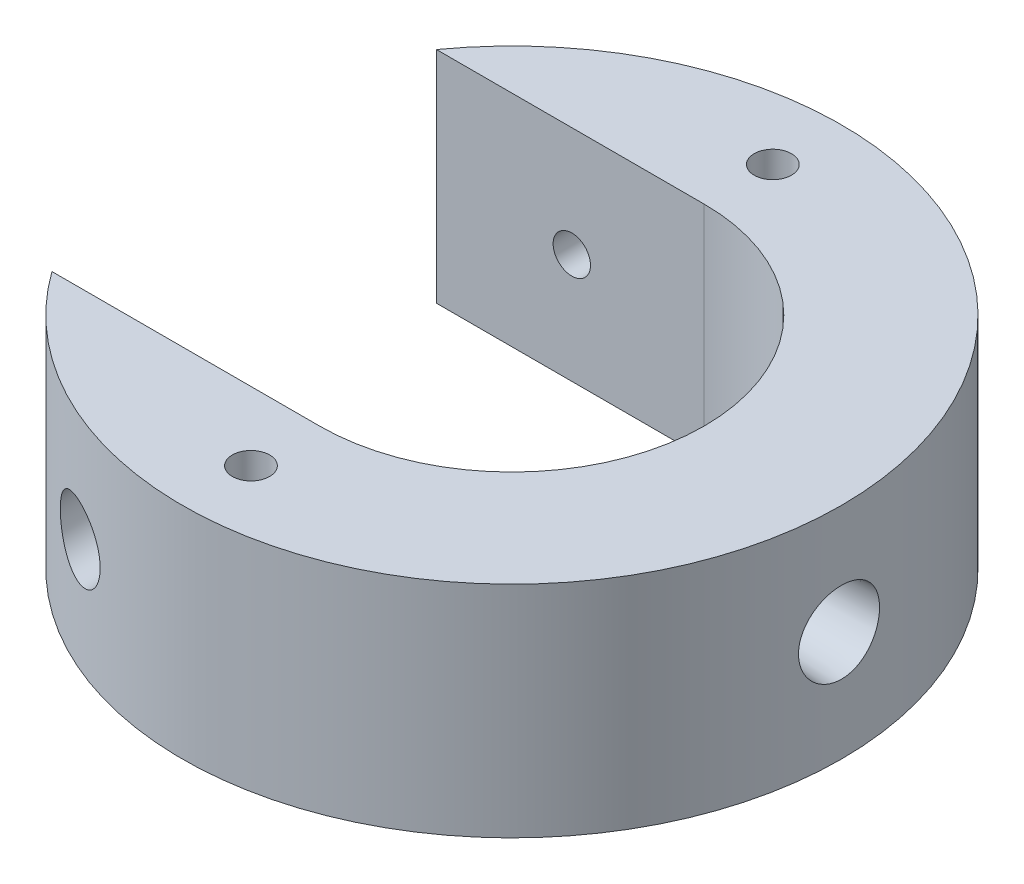
ISO-10303-21;
HEADER;
FILE_DESCRIPTION(('STEP AP214'),'2;1');
FILE_NAME('part.step','',(''),(''),'','','');
FILE_SCHEMA(('AUTOMOTIVE_DESIGN { 1 0 10303 214 1 1 1 1 }'));
ENDSEC;
DATA;
#1=APPLICATION_CONTEXT('core data for automotive mechanical design processes');
#2=APPLICATION_PROTOCOL_DEFINITION('international standard','automotive_design',2000,#1);
#3=PRODUCT_CONTEXT('',#1,'mechanical');
#4=PRODUCT('Part','Part','',(#3));
#5=PRODUCT_RELATED_PRODUCT_CATEGORY('part','',(#4));
#6=PRODUCT_DEFINITION_FORMATION('','',#4);
#7=PRODUCT_DEFINITION_CONTEXT('part definition',#1,'design');
#8=PRODUCT_DEFINITION('design','',#6,#7);
#9=PRODUCT_DEFINITION_SHAPE('','',#8);
#10=(LENGTH_UNIT() NAMED_UNIT(*) SI_UNIT(.MILLI.,.METRE.));
#11=(NAMED_UNIT(*) PLANE_ANGLE_UNIT() SI_UNIT($,.RADIAN.));
#12=(NAMED_UNIT(*) SI_UNIT($,.STERADIAN.) SOLID_ANGLE_UNIT());
#13=UNCERTAINTY_MEASURE_WITH_UNIT(LENGTH_MEASURE(1.E-05),#10,'distance_accuracy_value','');
#14=(GEOMETRIC_REPRESENTATION_CONTEXT(3) GLOBAL_UNCERTAINTY_ASSIGNED_CONTEXT((#13)) GLOBAL_UNIT_ASSIGNED_CONTEXT((#10,
#11,#12)) REPRESENTATION_CONTEXT('',''));
#15=CARTESIAN_POINT('',(0.,0.,0.));
#16=DIRECTION('',(0.,0.,1.));
#17=DIRECTION('',(1.,0.,0.));
#18=AXIS2_PLACEMENT_3D('',#15,#16,#17);
#19=CARTESIAN_POINT('',(0.,20.,0.));
#20=DIRECTION('',(0.,1.,0.));
#21=DIRECTION('',(0.,0.,1.));
#22=AXIS2_PLACEMENT_3D('',#19,#20,#21);
#23=PLANE('',#22);
#24=CARTESIAN_POINT('',(0.,20.,0.));
#25=DIRECTION('',(0.,1.,0.));
#26=DIRECTION('',(0.,0.,1.));
#27=AXIS2_PLACEMENT_3D('',#24,#25,#26);
#28=CIRCLE('',#27,30.);
#29=CARTESIAN_POINT('',(-24.3669858620224,20.,17.5));
#30=VERTEX_POINT('',#29);
#31=CARTESIAN_POINT('',(-24.3669858620224,20.,-17.5));
#32=VERTEX_POINT('',#31);
#33=EDGE_CURVE('E60',#30,#32,#28,.T.);
#34=ORIENTED_EDGE('',*,*,#33,.T.);
#35=DIRECTION('',(1.,0.,0.));
#36=VECTOR('',#35,1.);
#37=CARTESIAN_POINT('',(0.,20.,-17.5));
#38=LINE('',#37,#36);
#39=CARTESIAN_POINT('',(0.,20.,-17.5));
#40=VERTEX_POINT('',#39);
#41=EDGE_CURVE('E94',#32,#40,#38,.T.);
#42=ORIENTED_EDGE('',*,*,#41,.T.);
#43=CARTESIAN_POINT('',(0.,20.,0.));
#44=DIRECTION('',(0.,1.,0.));
#45=DIRECTION('',(0.,0.,1.));
#46=AXIS2_PLACEMENT_3D('',#43,#44,#45);
#47=CIRCLE('',#46,17.5);
#48=CARTESIAN_POINT('',(0.,20.,17.5));
#49=VERTEX_POINT('',#48);
#50=EDGE_CURVE('E105',#40,#49,#47,.F.);
#51=ORIENTED_EDGE('',*,*,#50,.T.);
#52=DIRECTION('',(1.,0.,0.));
#53=VECTOR('',#52,1.);
#54=CARTESIAN_POINT('',(0.,20.,17.5));
#55=LINE('',#54,#53);
#56=EDGE_CURVE('E117',#30,#49,#55,.T.);
#57=ORIENTED_EDGE('',*,*,#56,.F.);
#58=EDGE_LOOP('',(#34,#42,#51,#57));
#59=FACE_BOUND('',#58,.T.);
#60=CARTESIAN_POINT('',(0.,20.,-23.75));
#61=DIRECTION('',(0.,-1.,0.));
#62=DIRECTION('',(0.,0.,-1.));
#63=AXIS2_PLACEMENT_3D('',#60,#61,#62);
#64=CIRCLE('',#63,1.69999999999999);
#65=CARTESIAN_POINT('',(0.,20.,-25.45));
#66=VERTEX_POINT('',#65);
#67=EDGE_CURVE('E229',#66,#66,#64,.T.);
#68=ORIENTED_EDGE('',*,*,#67,.T.);
#69=EDGE_LOOP('',(#68));
#70=FACE_BOUND('',#69,.T.);
#71=CARTESIAN_POINT('',(0.,20.,23.75));
#72=DIRECTION('',(0.,-1.,0.));
#73=DIRECTION('',(0.,0.,-1.));
#74=AXIS2_PLACEMENT_3D('',#71,#72,#73);
#75=CIRCLE('',#74,1.69999999999999);
#76=CARTESIAN_POINT('',(0.,20.,22.05));
#77=VERTEX_POINT('',#76);
#78=EDGE_CURVE('E234',#77,#77,#75,.T.);
#79=ORIENTED_EDGE('',*,*,#78,.T.);
#80=EDGE_LOOP('',(#79));
#81=FACE_BOUND('',#80,.T.);
#82=ADVANCED_FACE('F45',(#59,#70,#81),#23,.T.);
#83=CARTESIAN_POINT('',(0.,0.,0.));
#84=DIRECTION('',(0.,1.,0.));
#85=DIRECTION('',(0.,0.,1.));
#86=AXIS2_PLACEMENT_3D('',#83,#84,#85);
#87=PLANE('',#86);
#88=CARTESIAN_POINT('',(0.,0.,-23.75));
#89=DIRECTION('',(0.,-1.,0.));
#90=DIRECTION('',(0.,0.,-1.));
#91=AXIS2_PLACEMENT_3D('',#88,#89,#90);
#92=CIRCLE('',#91,1.725);
#93=CARTESIAN_POINT('',(0.,0.,-25.475));
#94=VERTEX_POINT('',#93);
#95=EDGE_CURVE('E113',#94,#94,#92,.T.);
#96=ORIENTED_EDGE('',*,*,#95,.F.);
#97=EDGE_LOOP('',(#96));
#98=FACE_BOUND('',#97,.T.);
#99=CARTESIAN_POINT('',(0.,0.,23.75));
#100=DIRECTION('',(0.,-1.,0.));
#101=DIRECTION('',(0.,0.,-1.));
#102=AXIS2_PLACEMENT_3D('',#99,#100,#101);
#103=CIRCLE('',#102,1.725);
#104=CARTESIAN_POINT('',(0.,0.,22.025));
#105=VERTEX_POINT('',#104);
#106=EDGE_CURVE('E225',#105,#105,#103,.T.);
#107=ORIENTED_EDGE('',*,*,#106,.F.);
#108=EDGE_LOOP('',(#107));
#109=FACE_BOUND('',#108,.T.);
#110=DIRECTION('',(1.,0.,0.));
#111=VECTOR('',#110,1.);
#112=CARTESIAN_POINT('',(0.,0.,-17.5));
#113=LINE('',#112,#111);
#114=CARTESIAN_POINT('',(-24.3669858620224,0.,-17.5));
#115=VERTEX_POINT('',#114);
#116=CARTESIAN_POINT('',(0.,0.,-17.5));
#117=VERTEX_POINT('',#116);
#118=EDGE_CURVE('E68',#115,#117,#113,.T.);
#119=ORIENTED_EDGE('',*,*,#118,.F.);
#120=CARTESIAN_POINT('',(0.,0.,0.));
#121=DIRECTION('',(0.,1.,0.));
#122=DIRECTION('',(0.,0.,1.));
#123=AXIS2_PLACEMENT_3D('',#120,#121,#122);
#124=CIRCLE('',#123,30.);
#125=CARTESIAN_POINT('',(-24.3669858620224,0.,17.5));
#126=VERTEX_POINT('',#125);
#127=EDGE_CURVE('E111',#126,#115,#124,.T.);
#128=ORIENTED_EDGE('',*,*,#127,.F.);
#129=DIRECTION('',(1.,0.,0.));
#130=VECTOR('',#129,1.);
#131=CARTESIAN_POINT('',(0.,0.,17.5));
#132=LINE('',#131,#130);
#133=CARTESIAN_POINT('',(0.,0.,17.5));
#134=VERTEX_POINT('',#133);
#135=EDGE_CURVE('E104',#126,#134,#132,.T.);
#136=ORIENTED_EDGE('',*,*,#135,.T.);
#137=CARTESIAN_POINT('',(0.,0.,0.));
#138=DIRECTION('',(0.,1.,0.));
#139=DIRECTION('',(0.,0.,1.));
#140=AXIS2_PLACEMENT_3D('',#137,#138,#139);
#141=CIRCLE('',#140,17.5);
#142=EDGE_CURVE('E247',#117,#134,#141,.F.);
#143=ORIENTED_EDGE('',*,*,#142,.F.);
#144=EDGE_LOOP('',(#119,#128,#136,#143));
#145=FACE_BOUND('',#144,.T.);
#146=ADVANCED_FACE('F211',(#98,#109,#145),#87,.F.);
#147=CARTESIAN_POINT('',(0.,20.,0.));
#148=DIRECTION('',(0.,-1.,0.));
#149=DIRECTION('',(0.,0.,-1.));
#150=AXIS2_PLACEMENT_3D('',#147,#148,#149);
#151=CYLINDRICAL_SURFACE('',#150,30.);
#152=CARTESIAN_POINT('',(29.7974428902204,8.77412919164141,-3.48028694277516));
#153=CARTESIAN_POINT('',(29.8054746933433,8.57773882422208,-3.41152843723764));
#154=CARTESIAN_POINT('',(29.8152119278285,8.38708602588132,-3.32617804604608));
#155=CARTESIAN_POINT('',(29.8369987305228,8.02276425631804,-3.12469502953356));
#156=CARTESIAN_POINT('',(29.8490508414917,7.84911428137163,-3.00852850046526));
#157=CARTESIAN_POINT('',(29.8740905858605,7.52390633530904,-2.74876062685099));
#158=CARTESIAN_POINT('',(29.8870777696182,7.3723378506317,-2.60517241422096));
#159=CARTESIAN_POINT('',(29.9125266454618,7.09552912169683,-2.29455327474705));
#160=CARTESIAN_POINT('',(29.924988456602,6.9702828866543,-2.12752769656896));
#161=CARTESIAN_POINT('',(29.9479831061618,6.74968820901789,-1.77468657998163));
#162=CARTESIAN_POINT('',(29.9585162500359,6.6543350303768,-1.58887402422553));
#163=CARTESIAN_POINT('',(29.9764620293162,6.49632078010964,-1.20368370481639));
#164=CARTESIAN_POINT('',(29.9838747212882,6.43365911586619,-1.00430618713707));
#165=CARTESIAN_POINT('',(29.9946912543118,6.34328638542175,-0.599322929458535));
#166=CARTESIAN_POINT('',(29.9981261433738,6.31530451018869,-0.39377845207954));
#167=CARTESIAN_POINT('',(30.0007040597331,6.29424488825054,0.0191129212657524));
#168=CARTESIAN_POINT('',(29.9998472873787,6.30116551218763,0.226459732642355));
#169=CARTESIAN_POINT('',(29.993959177262,6.34953307671174,0.6356234825472));
#170=CARTESIAN_POINT('',(29.9889555148334,6.39075113190014,0.837467943423096));
#171=CARTESIAN_POINT('',(29.9753668178449,6.50618231065924,1.23135954795493));
#172=CARTESIAN_POINT('',(29.9667817233674,6.58039598625023,1.42340652763803));
#173=CARTESIAN_POINT('',(29.9469463184765,6.75995048926551,1.79298784608374));
#174=CARTESIAN_POINT('',(29.9356872342746,6.86539407455584,1.97047176558814));
#175=CARTESIAN_POINT('',(29.9117635380217,7.10430446773214,2.30534816506087));
#176=CARTESIAN_POINT('',(29.8990988487944,7.23777281470891,2.4627395408039));
#177=CARTESIAN_POINT('',(29.8736463571227,7.53030299150791,2.75443719097898));
#178=CARTESIAN_POINT('',(29.8608584564846,7.68958073854831,2.8885269814453));
#179=CARTESIAN_POINT('',(29.8367055514389,8.0284133673047,3.12818736753512));
#180=CARTESIAN_POINT('',(29.8253405727997,8.20796861612562,3.23375744671889));
#181=CARTESIAN_POINT('',(29.8052820264421,8.5829577677772,3.41371190579295));
#182=CARTESIAN_POINT('',(29.7965973860302,8.77844204999377,3.48799236384618));
#183=CARTESIAN_POINT('',(29.7829446822357,9.17922201131726,3.60271754464935));
#184=CARTESIAN_POINT('',(29.777976503673,9.38451738615038,3.64316331600374));
#185=CARTESIAN_POINT('',(29.7723403490883,9.79818334648389,3.68894161084181));
#186=CARTESIAN_POINT('',(29.7716546615096,10.0065376888028,3.69441875989832));
#187=CARTESIAN_POINT('',(29.7746147801904,10.4211986832693,3.67048420357918));
#188=CARTESIAN_POINT('',(29.7782605275075,10.6275053632432,3.6410729729668));
#189=CARTESIAN_POINT('',(29.789452067662,11.0316987920347,3.54833703892903));
#190=CARTESIAN_POINT('',(29.7969882532609,11.2296049885073,3.48509586295204));
#191=CARTESIAN_POINT('',(29.8151020795897,11.6119855576866,3.32656224642776));
#192=CARTESIAN_POINT('',(29.8256798144427,11.7964595145012,3.23126881398406));
#193=CARTESIAN_POINT('',(29.8487341701859,12.1475253486314,3.01087147763803));
#194=CARTESIAN_POINT('',(29.8612180504835,12.3140445242501,2.88565252803643));
#195=CARTESIAN_POINT('',(29.8866511493675,12.6237136745654,2.60908368973193));
#196=CARTESIAN_POINT('',(29.8996003791491,12.7668630865785,2.45773317202881));
#197=CARTESIAN_POINT('',(29.9245463139724,13.0261045310734,2.13263417301915));
#198=CARTESIAN_POINT('',(29.9365402840595,13.142120595022,1.95882487163714));
#199=CARTESIAN_POINT('',(29.9581788778209,13.3432092618498,1.59400731379149));
#200=CARTESIAN_POINT('',(29.9678235868433,13.4282829889113,1.40299968248407));
#201=CARTESIAN_POINT('',(29.9836220259679,13.564563821932,1.01033214608598));
#202=CARTESIAN_POINT('',(29.9897951504723,13.6159593469603,0.808738441422679));
#203=CARTESIAN_POINT('',(29.998034287396,13.6840868732086,0.399698291868715));
#204=CARTESIAN_POINT('',(30.0001005410917,13.7008209107752,0.192252191529468));
#205=CARTESIAN_POINT('',(29.9998927219866,13.6991241342174,-0.220736348938837));
#206=CARTESIAN_POINT('',(29.9976551135348,13.6809887507351,-0.426280086550249));
#207=CARTESIAN_POINT('',(29.9891626715587,13.6106882563201,-0.831373291844009));
#208=CARTESIAN_POINT('',(29.9829078469185,13.5585232206438,-1.03092277278162));
#209=CARTESIAN_POINT('',(29.9670797827959,13.4217356512745,-1.41835940400731));
#210=CARTESIAN_POINT('',(29.9575074146684,13.337121639704,-1.60624960135013));
#211=CARTESIAN_POINT('',(29.9361019932,13.1378877924467,-1.96524197966579));
#212=CARTESIAN_POINT('',(29.9242688253464,13.0232664367348,-2.13634330959294));
#213=CARTESIAN_POINT('',(29.8995402295509,12.766191782751,-2.45842248098917));
#214=CARTESIAN_POINT('',(29.88663685035,12.6235168815402,-2.60922284310534));
#215=CARTESIAN_POINT('',(29.8612908970752,12.3149540816842,-2.8848767127406));
#216=CARTESIAN_POINT('',(29.8488483251555,12.149066074542,-3.0097300989779));
#217=CARTESIAN_POINT('',(29.8257435941277,11.7976267189735,-3.23070900914539));
#218=CARTESIAN_POINT('',(29.8150925842107,11.6119631904887,-3.32665737700061));
#219=CARTESIAN_POINT('',(29.7968729898662,11.2269926964274,-3.48609246592427));
#220=CARTESIAN_POINT('',(29.7893050006428,11.0276831050263,-3.54957291938153));
#221=CARTESIAN_POINT('',(29.7781320093087,10.6215358764731,-3.64212006706352));
#222=CARTESIAN_POINT('',(29.7745194731728,10.4147133288265,-3.67125219335243));
#223=CARTESIAN_POINT('',(29.7716531048211,9.99923293660769,-3.69443387373953));
#224=CARTESIAN_POINT('',(29.7723946025434,9.7905772980324,-3.68852101642198));
#225=CARTESIAN_POINT('',(29.7771722546176,9.44608903910379,-3.64968214697108));
#226=CARTESIAN_POINT('',(29.7800327617162,9.30907960495354,-3.62637697963425));
#227=CARTESIAN_POINT('',(29.7874904156162,9.03857292362997,-3.56460227047025));
#228=CARTESIAN_POINT('',(29.792087554936,8.90507566132872,-3.52613279397156));
#229=CARTESIAN_POINT('',(29.7974428902204,8.77412919164141,-3.48028694277516));
#230=B_SPLINE_CURVE_WITH_KNOTS('',3,(#152,#153,#154,#155,#156,#157,#158,#159,#160,#161,#162,
#163,#164,#165,#166,#167,#168,#169,#170,#171,#172,#173,#174,#175,#176,#177,#178,#179,#180,#181,
#182,#183,#184,#185,#186,#187,#188,#189,#190,#191,#192,#193,#194,#195,#196,#197,#198,#199,#200,
#201,#202,#203,#204,#205,#206,#207,#208,#209,#210,#211,#212,#213,#214,#215,#216,#217,#218,#219,
#220,#221,#222,#223,#224,#225,#226,#227,#228,#229),.UNSPECIFIED.,.T.,.F.,(4,2,2,2,2,2,2,2,2,2,2,
2,2,2,2,2,2,2,2,2,2,2,2,2,2,2,2,2,2,2,2,2,2,2,2,2,2,2,4),(0.,0.624195759639858,1.24908112488521,
1.87366798702576,2.49811254265848,3.12245811559763,3.74679237028153,4.36621993592721,
4.98561858502426,5.60091649496531,6.21622469929435,6.83358042163997,7.4509700573925,
8.07382009598224,8.6966814124892,9.32159542395257,9.94649006736615,10.5687985462309,
11.19109855678,11.8118691286451,12.4326589127854,13.0558747806152,13.6791056516618,
14.3040611092935,14.9289938590696,15.5503997569302,16.171769146442,16.7878971830505,
17.4040238570983,18.0199888275798,18.6359850058736,19.2570581857716,19.8781342686347,
20.5029428524504,21.1278720039315,21.7516087593215,22.3746766276615,22.7908710893017,
23.2070637579783),.UNSPECIFIED.);
#231=CARTESIAN_POINT('',(29.7974428902204,8.77412919164141,-3.48028694277516));
#232=VERTEX_POINT('',#231);
#233=EDGE_CURVE('E11',#232,#232,#230,.T.);
#234=ORIENTED_EDGE('',*,*,#233,.T.);
#235=EDGE_LOOP('',(#234));
#236=FACE_BOUND('',#235,.T.);
#237=CARTESIAN_POINT('',(-15.2969858620224,10.,-25.8070188812479));
#238=CARTESIAN_POINT('',(-15.2969859340615,9.91739857448381,-25.8070187821705));
#239=CARTESIAN_POINT('',(-15.2938313195371,9.83480395677136,-25.8088896565349));
#240=CARTESIAN_POINT('',(-15.2812691470552,9.67025136899959,-25.816329291718));
#241=CARTESIAN_POINT('',(-15.2718595991448,9.58829360994894,-25.8218992293611));
#242=CARTESIAN_POINT('',(-15.2343728608325,9.34417679471965,-25.8440476042123));
#243=CARTESIAN_POINT('',(-15.1970376443802,9.18381108720318,-25.8660645443988));
#244=CARTESIAN_POINT('',(-15.0997924942252,8.87336947917239,-25.9229505464584));
#245=CARTESIAN_POINT('',(-15.0399696632729,8.7232564838625,-25.957770008249));
#246=CARTESIAN_POINT('',(-14.9003082997009,8.43584517919884,-26.038189022245));
#247=CARTESIAN_POINT('',(-14.8204688814624,8.2985474372152,-26.0837890514235));
#248=CARTESIAN_POINT('',(-14.6379930007011,8.03098356654614,-26.1866524958305));
#249=CARTESIAN_POINT('',(-14.5342444350232,7.90169164979141,-26.2444663569987));
#250=CARTESIAN_POINT('',(-14.3104322021602,7.66200326024154,-26.3671733219282));
#251=CARTESIAN_POINT('',(-14.1903615254633,7.55161495185734,-26.4320694647932));
#252=CARTESIAN_POINT('',(-13.9201978282535,7.33785977734722,-26.5754469024393));
#253=CARTESIAN_POINT('',(-13.7682322460791,7.23730286161255,-26.6545945710853));
#254=CARTESIAN_POINT('',(-13.4510099773248,7.06333889922654,-26.8160782582653));
#255=CARTESIAN_POINT('',(-13.2857464120489,6.98994601515745,-26.8984159153295));
#256=CARTESIAN_POINT('',(-12.9297199030707,6.86598860132161,-27.0714796125126));
#257=CARTESIAN_POINT('',(-12.7380168774543,6.81819562540757,-27.162271014976));
#258=CARTESIAN_POINT('',(-12.3481175994974,6.75797272392295,-27.3417275264944));
#259=CARTESIAN_POINT('',(-12.1499201451696,6.74554938237758,-27.4303922366221));
#260=CARTESIAN_POINT('',(-11.749581383977,6.75735979454625,-27.6042680740525));
#261=CARTESIAN_POINT('',(-11.5474246456784,6.78212939129508,-27.6894102052655));
#262=CARTESIAN_POINT('',(-11.148529932474,6.86999316131485,-27.8524086864818));
#263=CARTESIAN_POINT('',(-10.9517903859678,6.93307609426103,-27.9302671656266));
#264=CARTESIAN_POINT('',(-10.5811203603916,7.09272202109705,-28.0727136940084));
#265=CARTESIAN_POINT('',(-10.4065330614317,7.18732105306479,-28.1377879022971));
#266=CARTESIAN_POINT('',(-10.0753012739404,7.40874856819484,-28.2580848393824));
#267=CARTESIAN_POINT('',(-9.91864827733218,7.53556167623905,-28.3133122465148));
#268=CARTESIAN_POINT('',(-9.64049701308752,7.80766186726831,-28.4091696151848));
#269=CARTESIAN_POINT('',(-9.51725868752418,7.95089847042409,-28.4505754543485));
#270=CARTESIAN_POINT('',(-9.29659866478051,8.25827150850829,-28.5234429363588));
#271=CARTESIAN_POINT('',(-9.19916779953592,8.42240049068722,-28.5549081113802));
#272=CARTESIAN_POINT('',(-9.03878670999007,8.7567527354555,-28.6060666444355));
#273=CARTESIAN_POINT('',(-8.97419601795785,8.92610422363333,-28.6263258329982));
#274=CARTESIAN_POINT('',(-8.87395349732206,9.27397773807361,-28.6575598500407));
#275=CARTESIAN_POINT('',(-8.83829587383689,9.4524979203574,-28.6685365376917));
#276=CARTESIAN_POINT('',(-8.79789350183783,9.80785605489031,-28.6809606245914));
#277=CARTESIAN_POINT('',(-8.79225030968803,9.98458281538209,-28.6826849943693));
#278=CARTESIAN_POINT('',(-8.80965533481581,10.3364748430495,-28.6773439260352));
#279=CARTESIAN_POINT('',(-8.83270123951954,10.5116402349379,-28.6702791963959));
#280=CARTESIAN_POINT('',(-8.90636126705051,10.8540576060557,-28.6474812433018));
#281=CARTESIAN_POINT('',(-8.95676208480684,11.0213600701054,-28.631815080311));
#282=CARTESIAN_POINT('',(-9.08320753826633,11.3448729195863,-28.5919518007187));
#283=CARTESIAN_POINT('',(-9.15925248255885,11.5010831715116,-28.5677545814585));
#284=CARTESIAN_POINT('',(-9.33540526594524,11.8000813440401,-28.5106794815662));
#285=CARTESIAN_POINT('',(-9.43578705510394,11.9426886720412,-28.477702321151));
#286=CARTESIAN_POINT('',(-9.65671346801294,12.2088515035232,-28.403546116312));
#287=CARTESIAN_POINT('',(-9.77726034188155,12.3324048779108,-28.3623661564821));
#288=CARTESIAN_POINT('',(-10.0388871217435,12.5614944854785,-28.270842448733));
#289=CARTESIAN_POINT('',(-10.1805115228304,12.6663053816388,-28.2202420728396));
#290=CARTESIAN_POINT('',(-10.4766676829951,12.8508004898774,-28.1116400834364));
#291=CARTESIAN_POINT('',(-10.6312022683607,12.9304791817045,-28.053636847824));
#292=CARTESIAN_POINT('',(-10.9575374014838,13.0673456134137,-27.9278458311615));
#293=CARTESIAN_POINT('',(-11.1298201686755,13.1230472564791,-27.8596944857856));
#294=CARTESIAN_POINT('',(-11.4789529255738,13.2050002347404,-27.71766942433));
#295=CARTESIAN_POINT('',(-11.6558043710766,13.2312420612208,-27.6437938688729));
#296=CARTESIAN_POINT('',(-12.0220317526947,13.2554353432631,-27.4865993054418));
#297=CARTESIAN_POINT('',(-12.2114188120343,13.2512804535723,-27.4029811743148));
#298=CARTESIAN_POINT('',(-12.5855258282359,13.2105945920073,-27.233193074537));
#299=CARTESIAN_POINT('',(-12.7702441226551,13.174052250185,-27.1470222199959));
#300=CARTESIAN_POINT('',(-13.1411358267302,13.066712486603,-26.9695234902491));
#301=CARTESIAN_POINT('',(-13.3267677268175,12.994044430684,-26.8781874823211));
#302=CARTESIAN_POINT('',(-13.6829206450622,12.8153097898353,-26.6986427159267));
#303=CARTESIAN_POINT('',(-13.8534371709758,12.7092333183865,-26.6104348917888));
#304=CARTESIAN_POINT('',(-14.1743875965031,12.4652038632621,-26.440870829815));
#305=CARTESIAN_POINT('',(-14.3248109667964,12.3272342693802,-26.3595181924487));
#306=CARTESIAN_POINT('',(-14.5307838271206,12.0985284140731,-26.2461909584966));
#307=CARTESIAN_POINT('',(-14.5961968826824,12.0186148137724,-26.2098468103226));
#308=CARTESIAN_POINT('',(-14.719723505073,11.8519474424369,-26.140671924902));
#309=CARTESIAN_POINT('',(-14.7778417300279,11.7651980945896,-26.1078389475945));
#310=CARTESIAN_POINT('',(-14.8811022683755,11.5935475721854,-26.0491075777953));
#311=CARTESIAN_POINT('',(-14.9269426282168,11.5091881148796,-26.0228506251009));
#312=CARTESIAN_POINT('',(-15.0113159726843,11.3358621323672,-25.9742711409041));
#313=CARTESIAN_POINT('',(-15.0498534993882,11.2468985148994,-25.9519461644797));
#314=CARTESIAN_POINT('',(-15.1190001391266,11.0652022123562,-25.9117238766144));
#315=CARTESIAN_POINT('',(-15.1496264963302,10.9724782434759,-25.8938169389586));
#316=CARTESIAN_POINT('',(-15.2025369694935,10.7839488481412,-25.8627881752626));
#317=CARTESIAN_POINT('',(-15.2248257282936,10.6881451690166,-25.8496636861938));
#318=CARTESIAN_POINT('',(-15.2607107991941,10.4941827863938,-25.8284947817712));
#319=CARTESIAN_POINT('',(-15.2742910783285,10.3960200823573,-25.8204597367979));
#320=CARTESIAN_POINT('',(-15.2924284904867,10.1985682947448,-25.8097218909681));
#321=CARTESIAN_POINT('',(-15.2969857754381,10.0992792301625,-25.8070190003297));
#322=CARTESIAN_POINT('',(-15.2969858620224,10.,-25.8070188812479));
#323=B_SPLINE_CURVE_WITH_KNOTS('',3,(#237,#238,#239,#240,#241,#242,#243,#244,#245,#246,#247,
#248,#249,#250,#251,#252,#253,#254,#255,#256,#257,#258,#259,#260,#261,#262,#263,#264,#265,#266,
#267,#268,#269,#270,#271,#272,#273,#274,#275,#276,#277,#278,#279,#280,#281,#282,#283,#284,#285,
#286,#287,#288,#289,#290,#291,#292,#293,#294,#295,#296,#297,#298,#299,#300,#301,#302,#303,#304,
#305,#306,#307,#308,#309,#310,#311,#312,#313,#314,#315,#316,#317,#318,#319,#320,#321,#322),
.UNSPECIFIED.,.T.,.F.,(4,2,2,2,2,2,2,2,2,2,2,2,2,2,2,2,2,2,2,2,2,2,2,2,2,2,2,2,2,2,2,2,2,2,2,2,
2,2,2,2,2,2,4),(0.,0.247702116196247,0.49548307441353,0.991154122751766,1.48492471466314,
1.97871715693728,2.50333930186822,3.02818746115587,3.62172890614073,4.21557937291047,
4.86488146803572,5.51430442225429,6.1731738883886,6.83185014942776,7.4554146570445,
8.0786821074503,8.65601242610729,9.2331373730669,9.77757270325621,10.3218989638681,
10.8498358521197,11.3777301871325,11.9015660993507,12.4254083153887,12.9554459007865,
13.4855426698589,14.0330560528154,14.5806896126619,15.1585842581742,15.7366653765795,
16.3551657695817,16.9738833795494,17.6286261559064,18.2835628719866,18.9388414561888,
19.2668643584398,19.5946767238392,19.8928581077682,20.190853421389,20.4881935992657,
20.7853679541717,21.083087870415,21.3808027736615),.UNSPECIFIED.);
#324=CARTESIAN_POINT('',(-15.2969858620224,10.,-25.8070188812479));
#325=VERTEX_POINT('',#324);
#326=EDGE_CURVE('E135',#325,#325,#323,.T.);
#327=ORIENTED_EDGE('',*,*,#326,.T.);
#328=EDGE_LOOP('',(#327));
#329=FACE_BOUND('',#328,.T.);
#330=CARTESIAN_POINT('',(-8.7969858620224,10.,28.6812314893098));
#331=CARTESIAN_POINT('',(-8.79699443447112,9.82401154428674,28.6812303431146));
#332=CARTESIAN_POINT('',(-8.81133882200441,9.64789235347002,28.6768413753919));
#333=CARTESIAN_POINT('',(-8.86825103829739,9.30058235407611,28.6592912312116));
#334=CARTESIAN_POINT('',(-8.91085308003953,9.12939778258316,28.6461194208167));
#335=CARTESIAN_POINT('',(-9.02270546048117,8.79712458861181,28.6110851750029));
#336=CARTESIAN_POINT('',(-9.09192582405469,8.63602484595273,28.5892325142549));
#337=CARTESIAN_POINT('',(-9.25455618115442,8.32812899051905,28.5370013722723));
#338=CARTESIAN_POINT('',(-9.34796083547605,8.18132973043643,28.5066247727574));
#339=CARTESIAN_POINT('',(-9.55723123239168,7.90375374885878,28.437152008281));
#340=CARTESIAN_POINT('',(-9.67339074269182,7.77322770437152,28.3979406668986));
#341=CARTESIAN_POINT('',(-9.92345327247572,7.53360253773843,28.3115268378774));
#342=CARTESIAN_POINT('',(-10.0573594078016,7.42450718662894,28.2643229465514));
#343=CARTESIAN_POINT('',(-10.3445432501189,7.22585031490941,28.1605155726863));
#344=CARTESIAN_POINT('',(-10.4983899724419,7.13727265366111,28.1036061376124));
#345=CARTESIAN_POINT('',(-10.8161226345982,6.98696296785581,27.9828588279648));
#346=CARTESIAN_POINT('',(-10.9800111830676,6.92523795302128,27.9190191497205));
#347=CARTESIAN_POINT('',(-11.3237262297462,6.82614807403683,27.781460348934));
#348=CARTESIAN_POINT('',(-11.5039102229632,6.7905356785159,27.7073738035716));
#349=CARTESIAN_POINT('',(-11.8656702890262,6.74995525386689,27.5543915204421));
#350=CARTESIAN_POINT('',(-12.0472468090222,6.74499751931305,27.4754941760743));
#351=CARTESIAN_POINT('',(-12.4200249361472,6.76571861463035,27.3091094799407));
#352=CARTESIAN_POINT('',(-12.6110114743963,6.79356451066666,27.221407284898));
#353=CARTESIAN_POINT('',(-12.9847650322847,6.88230848081791,27.045122225139));
#354=CARTESIAN_POINT('',(-13.1675289941674,6.94321874245414,26.9565390475192));
#355=CARTESIAN_POINT('',(-13.5279985704336,7.10010637371814,26.7775179290516));
#356=CARTESIAN_POINT('',(-13.7051372005511,7.19749548222176,26.6871672378444));
#357=CARTESIAN_POINT('',(-14.0403218829312,7.42508505507352,26.5123581384981));
#358=CARTESIAN_POINT('',(-14.1983651381191,7.55529031770577,26.4279005943459));
#359=CARTESIAN_POINT('',(-14.4852734193059,7.84199248833948,26.2717095008594));
#360=CARTESIAN_POINT('',(-14.6148875831644,7.99755543458416,26.1996640274021));
#361=CARTESIAN_POINT('',(-14.7873574194974,8.24977646131861,26.1024607698086));
#362=CARTESIAN_POINT('',(-14.8411999138783,8.33702132139094,26.0718639829293));
#363=CARTESIAN_POINT('',(-14.9408637812641,8.51724986642851,26.0148779201383));
#364=CARTESIAN_POINT('',(-14.9866906446153,8.61022956377525,25.9884857653565));
#365=CARTESIAN_POINT('',(-15.0646796343379,8.78985639716651,25.9433462398071));
#366=CARTESIAN_POINT('',(-15.097817735562,8.87594708686236,25.9240634604216));
#367=CARTESIAN_POINT('',(-15.1568233943477,9.05133670493932,25.8896093499696));
#368=CARTESIAN_POINT('',(-15.1826953054005,9.14063367596725,25.8744355572261));
#369=CARTESIAN_POINT('',(-15.226772135643,9.32166874274966,25.8485215309946));
#370=CARTESIAN_POINT('',(-15.2449821370849,9.41340517729548,25.8377783587079));
#371=CARTESIAN_POINT('',(-15.2734518173576,9.59852344319436,25.8209594208007));
#372=CARTESIAN_POINT('',(-15.2837124602093,9.6919050736289,25.814883089232));
#373=CARTESIAN_POINT('',(-15.2953069403773,9.86729753460687,25.8080146819076));
#374=CARTESIAN_POINT('',(-15.2976208632889,9.94922270179062,25.8066424824546));
#375=CARTESIAN_POINT('',(-15.2960528250763,10.1130217801952,25.8075719381163));
#376=CARTESIAN_POINT('',(-15.2921688341083,10.1948956658352,25.8098747968287));
#377=CARTESIAN_POINT('',(-15.2782545579245,10.3578916328772,25.8181138707354));
#378=CARTESIAN_POINT('',(-15.268227683205,10.439014106108,25.8240480698269));
#379=CARTESIAN_POINT('',(-15.2421708012997,10.5999602135217,25.8394359814292));
#380=CARTESIAN_POINT('',(-15.226138523773,10.6797833445649,25.8488910249864));
#381=CARTESIAN_POINT('',(-15.1705970696413,10.9110712608833,25.8815538267636));
#382=CARTESIAN_POINT('',(-15.1231252201054,11.0600689921568,25.9093712069125));
#383=CARTESIAN_POINT('',(-15.008508700229,11.3475512502989,25.9759315029723));
#384=CARTESIAN_POINT('',(-14.9413596913538,11.4860334501544,26.0146768282694));
#385=CARTESIAN_POINT('',(-14.7840722354324,11.7600078262179,26.1044054351357));
#386=CARTESIAN_POINT('',(-14.6925868260166,11.8944959275846,26.1560888536315));
#387=CARTESIAN_POINT('',(-14.492635764993,12.1464401825174,26.2674057104725));
#388=CARTESIAN_POINT('',(-14.3841621805502,12.2638883294612,26.3270428609688));
#389=CARTESIAN_POINT('',(-14.1383519900299,12.4940957619802,26.4599484506562));
#390=CARTESIAN_POINT('',(-13.999099391582,12.6043663161825,26.5339862230927));
#391=CARTESIAN_POINT('',(-13.7062633450802,12.800062884834,26.6864316225391));
#392=CARTESIAN_POINT('',(-13.5526726046099,12.8854761648783,26.7648414649412));
#393=CARTESIAN_POINT('',(-13.2172183225548,13.0381894580891,26.9322096516371));
#394=CARTESIAN_POINT('',(-13.0340974797771,13.1025029965472,27.0213866700721));
#395=CARTESIAN_POINT('',(-12.6590285738809,13.1977117173655,27.1991193549223));
#396=CARTESIAN_POINT('',(-12.4670777795741,13.2285964864409,27.2876748191894));
#397=CARTESIAN_POINT('',(-12.0720763216702,13.2561442463949,27.4647678025339));
#398=CARTESIAN_POINT('',(-11.8688772795057,13.2515042578049,27.553184414644));
#399=CARTESIAN_POINT('',(-11.4643826374922,13.2038282325387,27.7239264148317));
#400=CARTESIAN_POINT('',(-11.2630867071489,13.1607989910835,27.8062528781242));
#401=CARTESIAN_POINT('',(-10.8770453753002,13.0386023033061,27.9594589595804));
#402=CARTESIAN_POINT('',(-10.6919604904142,12.9609187356679,28.0306609319826));
#403=CARTESIAN_POINT('',(-10.3367408428728,12.7709324043242,28.163588954286));
#404=CARTESIAN_POINT('',(-10.1665985210654,12.6586472760197,28.2253198073869));
#405=CARTESIAN_POINT('',(-9.85992126565228,12.4114665779285,28.333840751312));
#406=CARTESIAN_POINT('',(-9.72183843112789,12.278825517101,28.381393400426));
#407=CARTESIAN_POINT('',(-9.46988257221363,11.9894221190366,28.4664547993344));
#408=CARTESIAN_POINT('',(-9.35600637206949,11.8326629505972,28.5039648668184));
#409=CARTESIAN_POINT('',(-9.16347547264902,11.510270572103,28.5664200027429));
#410=CARTESIAN_POINT('',(-9.08306090777206,11.3458088833437,28.5920051175475));
#411=CARTESIAN_POINT('',(-8.95082957910123,11.00481138857,28.6336778729789));
#412=CARTESIAN_POINT('',(-8.89896907140514,10.8282945196977,28.6497800438221));
#413=CARTESIAN_POINT('',(-8.84064898889711,10.5420028587218,28.667811133853));
#414=CARTESIAN_POINT('',(-8.82430068841132,10.434332752522,28.6728416553473));
#415=CARTESIAN_POINT('',(-8.80246657004466,10.2177917757503,28.6795521575876));
#416=CARTESIAN_POINT('',(-8.79698055645247,10.1089209268483,28.6812321987009));
#417=CARTESIAN_POINT('',(-8.7969858620224,10.,28.6812314893098));
#418=B_SPLINE_CURVE_WITH_KNOTS('',3,(#330,#331,#332,#333,#334,#335,#336,#337,#338,#339,#340,
#341,#342,#343,#344,#345,#346,#347,#348,#349,#350,#351,#352,#353,#354,#355,#356,#357,#358,#359,
#360,#361,#362,#363,#364,#365,#366,#367,#368,#369,#370,#371,#372,#373,#374,#375,#376,#377,#378,
#379,#380,#381,#382,#383,#384,#385,#386,#387,#388,#389,#390,#391,#392,#393,#394,#395,#396,#397,
#398,#399,#400,#401,#402,#403,#404,#405,#406,#407,#408,#409,#410,#411,#412,#413,#414,#415,#416,
#417),.UNSPECIFIED.,.T.,.F.,(4,2,2,2,2,2,2,2,2,2,2,2,2,2,2,2,2,2,2,2,2,2,2,2,2,2,2,2,2,2,2,2,2,
2,2,2,2,2,2,2,2,2,2,4),(0.,0.527560437245169,1.0557607875983,1.58336806056311,2.11085895199777,
2.64567148652685,3.18057804482051,3.73740793993414,4.29438310506122,4.885975403995,
5.47776636310042,6.11094894945552,6.74436508547324,7.40536838578766,8.06646839224054,
8.70719378077538,9.02772281605992,9.34803143622943,9.63035880122766,9.91251664897346,
10.194487041268,10.4764232335824,10.7220221998582,10.9677016173829,11.2132447584665,
11.4588808209139,11.9331333890851,12.4074906020034,12.9174417839064,13.4276318076647,
14.0026000723562,14.5778623773899,15.2157865069698,15.8539092970333,16.51554634927,
17.1770663094082,17.8126355913525,18.4478814765328,19.0366635816299,19.6253683945741,
20.1771850847037,20.7281540403348,21.0546720890165,21.3811842546035),.UNSPECIFIED.);
#419=CARTESIAN_POINT('',(-8.7969858620224,10.,28.6812314893098));
#420=VERTEX_POINT('',#419);
#421=EDGE_CURVE('E126',#420,#420,#418,.T.);
#422=ORIENTED_EDGE('',*,*,#421,.T.);
#423=EDGE_LOOP('',(#422));
#424=FACE_BOUND('',#423,.T.);
#425=ORIENTED_EDGE('',*,*,#127,.T.);
#426=DIRECTION('',(0.,1.,0.));
#427=VECTOR('',#426,1.);
#428=CARTESIAN_POINT('',(-24.3669858620224,0.,-17.5));
#429=LINE('',#428,#427);
#430=EDGE_CURVE('E97',#115,#32,#429,.T.);
#431=ORIENTED_EDGE('',*,*,#430,.T.);
#432=ORIENTED_EDGE('',*,*,#33,.F.);
#433=DIRECTION('',(0.,1.,0.));
#434=VECTOR('',#433,1.);
#435=CARTESIAN_POINT('',(-24.3669858620224,0.,17.5));
#436=LINE('',#435,#434);
#437=EDGE_CURVE('E114',#126,#30,#436,.T.);
#438=ORIENTED_EDGE('',*,*,#437,.F.);
#439=EDGE_LOOP('',(#425,#431,#432,#438));
#440=FACE_BOUND('',#439,.T.);
#441=ADVANCED_FACE('F109',(#236,#329,#424,#440),#151,.T.);
#442=CARTESIAN_POINT('',(0.,0.,-17.5));
#443=DIRECTION('',(0.,0.,1.));
#444=DIRECTION('',(1.,0.,0.));
#445=AXIS2_PLACEMENT_3D('',#442,#443,#444);
#446=PLANE('',#445);
#447=CARTESIAN_POINT('',(-12.0469858620224,10.,-17.5));
#448=DIRECTION('',(0.,0.,1.));
#449=DIRECTION('',(1.,0.,0.));
#450=AXIS2_PLACEMENT_3D('',#447,#448,#449);
#451=CIRCLE('',#450,1.7);
#452=CARTESIAN_POINT('',(-10.3469858620224,10.,-17.5));
#453=VERTEX_POINT('',#452);
#454=EDGE_CURVE('E279',#453,#453,#451,.T.);
#455=ORIENTED_EDGE('',*,*,#454,.F.);
#456=EDGE_LOOP('',(#455));
#457=FACE_BOUND('',#456,.T.);
#458=ORIENTED_EDGE('',*,*,#41,.F.);
#459=ORIENTED_EDGE('',*,*,#430,.F.);
#460=ORIENTED_EDGE('',*,*,#118,.T.);
#461=DIRECTION('',(0.,1.,0.));
#462=VECTOR('',#461,1.);
#463=CARTESIAN_POINT('',(0.,0.,-17.5));
#464=LINE('',#463,#462);
#465=EDGE_CURVE('E99',#117,#40,#464,.T.);
#466=ORIENTED_EDGE('',*,*,#465,.T.);
#467=EDGE_LOOP('',(#458,#459,#460,#466));
#468=FACE_BOUND('',#467,.T.);
#469=ADVANCED_FACE('F96',(#457,#468),#446,.T.);
#470=CARTESIAN_POINT('',(0.,0.,0.));
#471=DIRECTION('',(0.,1.,0.));
#472=DIRECTION('',(0.,0.,1.));
#473=AXIS2_PLACEMENT_3D('',#470,#471,#472);
#474=CYLINDRICAL_SURFACE('',#473,17.5);
#475=CARTESIAN_POINT('',(17.1665372163404,10.,-3.39999999999989));
#476=CARTESIAN_POINT('',(17.1665409341345,9.81096442153522,-3.39999288602142));
#477=CARTESIAN_POINT('',(17.1696935971963,9.62183800307766,-3.38418128332424));
#478=CARTESIAN_POINT('',(17.1819464032907,9.24892736064971,-3.32140066108803));
#479=CARTESIAN_POINT('',(17.191051438124,9.06514766060705,-3.27440601410513));
#480=CARTESIAN_POINT('',(17.2141397421401,8.70837976067481,-3.15076479313096));
#481=CARTESIAN_POINT('',(17.2281183013061,8.53538133082971,-3.07414684081512));
#482=CARTESIAN_POINT('',(17.2593730342677,8.20470170547585,-2.89351110754543));
#483=CARTESIAN_POINT('',(17.2766489900542,8.04701949836637,-2.78949513785321));
#484=CARTESIAN_POINT('',(17.3128096341154,7.74933305397966,-2.5555355588518));
#485=CARTESIAN_POINT('',(17.3317111061273,7.6095630601553,-2.42529644970271));
#486=CARTESIAN_POINT('',(17.3688451039652,7.35371168644322,-2.14322614761029));
#487=CARTESIAN_POINT('',(17.3870775842306,7.23763191749227,-1.99139348749461));
#488=CARTESIAN_POINT('',(17.4209997479165,7.03155236210851,-1.66890069711919));
#489=CARTESIAN_POINT('',(17.4366673410163,6.94177436902766,-1.49809631360285));
#490=CARTESIAN_POINT('',(17.4635061898097,6.79227698229063,-1.14347282870884));
#491=CARTESIAN_POINT('',(17.4746778425033,6.73255493452181,-0.959654878139657));
#492=CARTESIAN_POINT('',(17.4911475071238,6.64559167588535,-0.586651511551329));
#493=CARTESIAN_POINT('',(17.4965169353474,6.61795521877252,-0.397561450227457));
#494=CARTESIAN_POINT('',(17.5010235821175,6.59471524231372,-0.0173574953421108));
#495=CARTESIAN_POINT('',(17.5001613687573,6.59910880302558,0.173756212152288));
#496=CARTESIAN_POINT('',(17.4923574380971,6.63950280977262,0.549869000318908));
#497=CARTESIAN_POINT('',(17.4854975999957,6.67507758807774,0.734915742407414));
#498=CARTESIAN_POINT('',(17.4665612962105,6.77614992553997,1.09636220535563));
#499=CARTESIAN_POINT('',(17.4544846302796,6.84164863332747,1.27276159399874));
#500=CARTESIAN_POINT('',(17.4263357761014,7.00110911779061,1.61312980905234));
#501=CARTESIAN_POINT('',(17.4102400605046,7.09523923568523,1.77701774335953));
#502=CARTESIAN_POINT('',(17.3758301170482,7.30916621306142,2.08683028933723));
#503=CARTESIAN_POINT('',(17.3575156477448,7.42896586698251,2.23275294254415));
#504=CARTESIAN_POINT('',(17.3203381266792,7.69317131651041,2.50501697538821));
#505=CARTESIAN_POINT('',(17.3014710070017,7.8379495892621,2.63099660948754));
#506=CARTESIAN_POINT('',(17.2656015306264,8.14676663503642,2.85694437056971));
#507=CARTESIAN_POINT('',(17.2485992053516,8.31080573252011,2.95691205927322));
#508=CARTESIAN_POINT('',(17.2183773315807,8.65398891403875,3.12811288530723));
#509=CARTESIAN_POINT('',(17.2051651395365,8.83316151094074,3.19929025038879));
#510=CARTESIAN_POINT('',(17.1841294970243,9.2012379383949,3.3104266772341));
#511=CARTESIAN_POINT('',(17.1763053871518,9.39014057512298,3.35038955916923));
#512=CARTESIAN_POINT('',(17.1670631295675,9.76904390489904,3.39742778072751));
#513=CARTESIAN_POINT('',(17.1655434811486,9.95897749464441,3.40502426803981));
#514=CARTESIAN_POINT('',(17.168810143744,10.3373984951936,3.38851393182457));
#515=CARTESIAN_POINT('',(17.173596118537,10.5258859825659,3.36440879865529));
#516=CARTESIAN_POINT('',(17.1888399510588,10.8943304766403,3.28562788991022));
#517=CARTESIAN_POINT('',(17.199246573914,11.0743488117312,3.23122812713194));
#518=CARTESIAN_POINT('',(17.2245145771637,11.4227158145076,3.09369624028221));
#519=CARTESIAN_POINT('',(17.2393763067287,11.5910635662329,3.01056186404668));
#520=CARTESIAN_POINT('',(17.2721094564323,11.9135982376786,2.81673176042261));
#521=CARTESIAN_POINT('',(17.2900157631926,12.0675847073473,2.70570848762759));
#522=CARTESIAN_POINT('',(17.3267236433622,12.354931220848,2.4596910967336));
#523=CARTESIAN_POINT('',(17.3455253033546,12.4882892645329,2.3246946569015));
#524=CARTESIAN_POINT('',(17.3822333291536,12.7325558463943,2.03222898207675));
#525=CARTESIAN_POINT('',(17.4001228726349,12.8431128845349,1.87446372601359));
#526=CARTESIAN_POINT('',(17.4327029202888,13.0361517554421,1.54229603925351));
#527=CARTESIAN_POINT('',(17.447393553771,13.1186347231239,1.36789428146448));
#528=CARTESIAN_POINT('',(17.4718484749833,13.2526652792508,1.0083501197457));
#529=CARTESIAN_POINT('',(17.4816395802209,13.3043815696247,0.823272508967075));
#530=CARTESIAN_POINT('',(17.4953069888768,13.3759471116742,0.446849025341098));
#531=CARTESIAN_POINT('',(17.4991839627113,13.3957999753484,0.255503865485009));
#532=CARTESIAN_POINT('',(17.5005715979481,13.4029417828372,-0.124659495344756));
#533=CARTESIAN_POINT('',(17.4981857946069,13.390760307321,-0.313467571660151));
#534=CARTESIAN_POINT('',(17.487532450071,13.3353441443488,-0.686291852027598));
#535=CARTESIAN_POINT('',(17.4792649744562,13.2921098031289,-0.870308109484183));
#536=CARTESIAN_POINT('',(17.457778770861,13.1760449393679,-1.2280184499768));
#537=CARTESIAN_POINT('',(17.444570129914,13.1032746867164,-1.40173273240553));
#538=CARTESIAN_POINT('',(17.4146273531426,12.9302689774888,-1.73456298917606));
#539=CARTESIAN_POINT('',(17.3978929581702,12.8300315018687,-1.89367788920719));
#540=CARTESIAN_POINT('',(17.3624188681835,12.6031333362764,-2.19542079460467));
#541=CARTESIAN_POINT('',(17.3436524214449,12.4760920235823,-2.33775947503804));
#542=CARTESIAN_POINT('',(17.3063927776803,12.1999781513547,-2.59928090563218));
#543=CARTESIAN_POINT('',(17.2878996461814,12.0509003999241,-2.71845818348999));
#544=CARTESIAN_POINT('',(17.2530764232378,11.7331489846134,-2.93140677373942));
#545=CARTESIAN_POINT('',(17.236769954708,11.5642933309311,-3.02491053789631));
#546=CARTESIAN_POINT('',(17.2084528050652,11.2130023275198,-3.18207173415814));
#547=CARTESIAN_POINT('',(17.1964381557879,11.0305797112122,-3.24575675333573));
#548=CARTESIAN_POINT('',(17.1805131493481,10.7064040043415,-3.32884659570728));
#549=CARTESIAN_POINT('',(17.1753040211933,10.5665231886762,-3.35548232186736));
#550=CARTESIAN_POINT('',(17.1683147089631,10.2844453467969,-3.39106142672852));
#551=CARTESIAN_POINT('',(17.1665344187177,10.1422483924369,-3.40000535323556));
#552=CARTESIAN_POINT('',(17.1665372163404,10.,-3.39999999999989));
#553=B_SPLINE_CURVE_WITH_KNOTS('',3,(#475,#476,#477,#478,#479,#480,#481,#482,#483,#484,#485,
#486,#487,#488,#489,#490,#491,#492,#493,#494,#495,#496,#497,#498,#499,#500,#501,#502,#503,#504,
#505,#506,#507,#508,#509,#510,#511,#512,#513,#514,#515,#516,#517,#518,#519,#520,#521,#522,#523,
#524,#525,#526,#527,#528,#529,#530,#531,#532,#533,#534,#535,#536,#537,#538,#539,#540,#541,#542,
#543,#544,#545,#546,#547,#548,#549,#550,#551,#552),.UNSPECIFIED.,.T.,.F.,(4,2,2,2,2,2,2,2,2,2,2,
2,2,2,2,2,2,2,2,2,2,2,2,2,2,2,2,2,2,2,2,2,2,2,2,2,2,2,4),(0.,0.566586028012602,1.13363827623754,
1.70014400914626,2.26661230019709,2.83986241297365,3.41315149381494,3.99114425526458,
4.5690859676731,5.13983012604809,5.71052225450859,6.2735428854383,6.83658512973766,
7.40300401549565,7.96948459415736,8.54528718314107,9.12109947328469,9.69802193813716,
10.2748737855089,10.8424014954154,11.4098989454725,11.9723086046293,12.5347623543799,
13.1041589369331,13.6736106940317,14.2512749887285,14.8289159281443,15.4033595947258,
15.9777381384827,16.5426811790713,17.1076179207066,17.6714076229701,18.235238779066,
18.807692016749,19.3802803429376,19.9586269111348,20.5364373545321,20.962803904113,
21.389157251544),.UNSPECIFIED.);
#554=CARTESIAN_POINT('',(17.1665372163404,10.,-3.39999999999989));
#555=VERTEX_POINT('',#554);
#556=EDGE_CURVE('E185',#555,#555,#553,.T.);
#557=ORIENTED_EDGE('',*,*,#556,.F.);
#558=EDGE_LOOP('',(#557));
#559=FACE_BOUND('',#558,.T.);
#560=ORIENTED_EDGE('',*,*,#50,.F.);
#561=ORIENTED_EDGE('',*,*,#465,.F.);
#562=ORIENTED_EDGE('',*,*,#142,.T.);
#563=DIRECTION('',(0.,1.,0.));
#564=VECTOR('',#563,1.);
#565=CARTESIAN_POINT('',(0.,0.,17.5));
#566=LINE('',#565,#564);
#567=EDGE_CURVE('E79',#134,#49,#566,.T.);
#568=ORIENTED_EDGE('',*,*,#567,.T.);
#569=EDGE_LOOP('',(#560,#561,#562,#568));
#570=FACE_BOUND('',#569,.T.);
#571=ADVANCED_FACE('F178',(#559,#570),#474,.F.);
#572=CARTESIAN_POINT('',(0.,0.,17.5));
#573=DIRECTION('',(0.,0.,1.));
#574=DIRECTION('',(1.,0.,0.));
#575=AXIS2_PLACEMENT_3D('',#572,#573,#574);
#576=PLANE('',#575);
#577=CARTESIAN_POINT('',(-12.0469858620224,10.,17.5));
#578=DIRECTION('',(0.,0.,1.));
#579=DIRECTION('',(1.,0.,0.));
#580=AXIS2_PLACEMENT_3D('',#577,#578,#579);
#581=CIRCLE('',#580,1.7);
#582=CARTESIAN_POINT('',(-10.3469858620224,10.,17.5));
#583=VERTEX_POINT('',#582);
#584=EDGE_CURVE('E134',#583,#583,#581,.T.);
#585=ORIENTED_EDGE('',*,*,#584,.T.);
#586=EDGE_LOOP('',(#585));
#587=FACE_BOUND('',#586,.T.);
#588=ORIENTED_EDGE('',*,*,#56,.T.);
#589=ORIENTED_EDGE('',*,*,#567,.F.);
#590=ORIENTED_EDGE('',*,*,#135,.F.);
#591=ORIENTED_EDGE('',*,*,#437,.T.);
#592=EDGE_LOOP('',(#588,#589,#590,#591));
#593=FACE_BOUND('',#592,.T.);
#594=ADVANCED_FACE('F174',(#587,#593),#576,.F.);
#595=CARTESIAN_POINT('',(0.,0.,23.75));
#596=DIRECTION('',(0.,-1.,0.));
#597=DIRECTION('',(0.,0.,-1.));
#598=AXIS2_PLACEMENT_3D('',#595,#596,#597);
#599=CYLINDRICAL_SURFACE('',#598,1.7);
#600=ORIENTED_EDGE('',*,*,#78,.F.);
#601=EDGE_LOOP('',(#600));
#602=FACE_BOUND('',#601,.T.);
#603=CARTESIAN_POINT('',(0.,0.0250000000000042,23.75));
#604=DIRECTION('',(0.,-1.,0.));
#605=DIRECTION('',(0.,0.,-1.));
#606=AXIS2_PLACEMENT_3D('',#603,#604,#605);
#607=CIRCLE('',#606,1.7);
#608=CARTESIAN_POINT('',(0.,0.0250000000000042,22.05));
#609=VERTEX_POINT('',#608);
#610=EDGE_CURVE('E228',#609,#609,#607,.T.);
#611=ORIENTED_EDGE('',*,*,#610,.T.);
#612=EDGE_LOOP('',(#611));
#613=FACE_BOUND('',#612,.T.);
#614=ADVANCED_FACE('F170',(#602,#613),#599,.F.);
#615=CARTESIAN_POINT('',(0.,0.,23.75));
#616=DIRECTION('',(0.,-1.,0.));
#617=DIRECTION('',(0.,0.,-1.));
#618=AXIS2_PLACEMENT_3D('',#615,#616,#617);
#619=CONICAL_SURFACE('',#618,1.725,0.785398163397422);
#620=ORIENTED_EDGE('',*,*,#610,.F.);
#621=EDGE_LOOP('',(#620));
#622=FACE_BOUND('',#621,.T.);
#623=ORIENTED_EDGE('',*,*,#106,.T.);
#624=EDGE_LOOP('',(#623));
#625=FACE_BOUND('',#624,.T.);
#626=ADVANCED_FACE('F166',(#622,#625),#619,.F.);
#627=CARTESIAN_POINT('',(0.,0.,-23.75));
#628=DIRECTION('',(0.,-1.,0.));
#629=DIRECTION('',(0.,0.,-1.));
#630=AXIS2_PLACEMENT_3D('',#627,#628,#629);
#631=CYLINDRICAL_SURFACE('',#630,1.7);
#632=ORIENTED_EDGE('',*,*,#67,.F.);
#633=EDGE_LOOP('',(#632));
#634=FACE_BOUND('',#633,.T.);
#635=CARTESIAN_POINT('',(0.,0.0250000000000042,-23.75));
#636=DIRECTION('',(0.,-1.,0.));
#637=DIRECTION('',(0.,0.,-1.));
#638=AXIS2_PLACEMENT_3D('',#635,#636,#637);
#639=CIRCLE('',#638,1.7);
#640=CARTESIAN_POINT('',(0.,0.0250000000000042,-25.45));
#641=VERTEX_POINT('',#640);
#642=EDGE_CURVE('E237',#641,#641,#639,.T.);
#643=ORIENTED_EDGE('',*,*,#642,.T.);
#644=EDGE_LOOP('',(#643));
#645=FACE_BOUND('',#644,.T.);
#646=ADVANCED_FACE('F162',(#634,#645),#631,.F.);
#647=CARTESIAN_POINT('',(0.,0.,-23.75));
#648=DIRECTION('',(0.,-1.,0.));
#649=DIRECTION('',(0.,0.,-1.));
#650=AXIS2_PLACEMENT_3D('',#647,#648,#649);
#651=CONICAL_SURFACE('',#650,1.725,0.785398163397422);
#652=ORIENTED_EDGE('',*,*,#642,.F.);
#653=EDGE_LOOP('',(#652));
#654=FACE_BOUND('',#653,.T.);
#655=ORIENTED_EDGE('',*,*,#95,.T.);
#656=EDGE_LOOP('',(#655));
#657=FACE_BOUND('',#656,.T.);
#658=ADVANCED_FACE('F148',(#654,#657),#651,.F.);
#659=CARTESIAN_POINT('',(-12.0469858620224,10.,30.));
#660=DIRECTION('',(0.,0.,1.));
#661=DIRECTION('',(1.,0.,0.));
#662=AXIS2_PLACEMENT_3D('',#659,#660,#661);
#663=CYLINDRICAL_SURFACE('',#662,3.25);
#664=CARTESIAN_POINT('',(-12.0469858620224,10.,23.));
#665=DIRECTION('',(0.,0.,1.));
#666=DIRECTION('',(1.,0.,0.));
#667=AXIS2_PLACEMENT_3D('',#664,#665,#666);
#668=CIRCLE('',#667,3.25);
#669=CARTESIAN_POINT('',(-8.7969858620224,10.,23.));
#670=VERTEX_POINT('',#669);
#671=EDGE_CURVE('E275',#670,#670,#668,.T.);
#672=ORIENTED_EDGE('',*,*,#671,.F.);
#673=EDGE_LOOP('',(#672));
#674=FACE_BOUND('',#673,.T.);
#675=ORIENTED_EDGE('',*,*,#421,.F.);
#676=EDGE_LOOP('',(#675));
#677=FACE_BOUND('',#676,.T.);
#678=ADVANCED_FACE('F142',(#674,#677),#663,.F.);
#679=CARTESIAN_POINT('',(-12.0469858620224,10.,30.));
#680=DIRECTION('',(0.,0.,1.));
#681=DIRECTION('',(1.,0.,0.));
#682=AXIS2_PLACEMENT_3D('',#679,#680,#681);
#683=CYLINDRICAL_SURFACE('',#682,1.7);
#684=ORIENTED_EDGE('',*,*,#584,.F.);
#685=EDGE_LOOP('',(#684));
#686=FACE_BOUND('',#685,.T.);
#687=CARTESIAN_POINT('',(-12.0469858620224,10.,23.));
#688=DIRECTION('',(0.,0.,1.));
#689=DIRECTION('',(1.,0.,0.));
#690=AXIS2_PLACEMENT_3D('',#687,#688,#689);
#691=CIRCLE('',#690,1.7);
#692=CARTESIAN_POINT('',(-10.3469858620224,10.,23.));
#693=VERTEX_POINT('',#692);
#694=EDGE_CURVE('E271',#693,#693,#691,.T.);
#695=ORIENTED_EDGE('',*,*,#694,.T.);
#696=EDGE_LOOP('',(#695));
#697=FACE_BOUND('',#696,.T.);
#698=ADVANCED_FACE('F147',(#686,#697),#683,.F.);
#699=CARTESIAN_POINT('',(-8.7969858620224,10.,23.));
#700=DIRECTION('',(0.,0.,-1.));
#701=DIRECTION('',(-1.,0.,0.));
#702=AXIS2_PLACEMENT_3D('',#699,#700,#701);
#703=PLANE('',#702);
#704=ORIENTED_EDGE('',*,*,#694,.F.);
#705=EDGE_LOOP('',(#704));
#706=FACE_BOUND('',#705,.T.);
#707=ORIENTED_EDGE('',*,*,#671,.T.);
#708=EDGE_LOOP('',(#707));
#709=FACE_BOUND('',#708,.T.);
#710=ADVANCED_FACE('F152',(#706,#709),#703,.F.);
#711=CARTESIAN_POINT('',(-12.0469858620224,10.,-30.));
#712=DIRECTION('',(0.,0.,-1.));
#713=DIRECTION('',(-1.,0.,0.));
#714=AXIS2_PLACEMENT_3D('',#711,#712,#713);
#715=CYLINDRICAL_SURFACE('',#714,3.25);
#716=CARTESIAN_POINT('',(-12.0469858620224,10.,-23.));
#717=DIRECTION('',(0.,0.,-1.));
#718=DIRECTION('',(-1.,0.,0.));
#719=AXIS2_PLACEMENT_3D('',#716,#717,#718);
#720=CIRCLE('',#719,3.25);
#721=CARTESIAN_POINT('',(-15.2969858620224,10.,-23.));
#722=VERTEX_POINT('',#721);
#723=EDGE_CURVE('E192',#722,#722,#720,.T.);
#724=ORIENTED_EDGE('',*,*,#723,.F.);
#725=EDGE_LOOP('',(#724));
#726=FACE_BOUND('',#725,.T.);
#727=ORIENTED_EDGE('',*,*,#326,.F.);
#728=EDGE_LOOP('',(#727));
#729=FACE_BOUND('',#728,.T.);
#730=ADVANCED_FACE('F155',(#726,#729),#715,.F.);
#731=CARTESIAN_POINT('',(-12.0469858620224,10.,-30.));
#732=DIRECTION('',(0.,0.,-1.));
#733=DIRECTION('',(-1.,0.,0.));
#734=AXIS2_PLACEMENT_3D('',#731,#732,#733);
#735=CYLINDRICAL_SURFACE('',#734,1.7);
#736=CARTESIAN_POINT('',(-12.0469858620224,10.,-23.));
#737=DIRECTION('',(0.,0.,-1.));
#738=DIRECTION('',(-1.,0.,0.));
#739=AXIS2_PLACEMENT_3D('',#736,#737,#738);
#740=CIRCLE('',#739,1.7);
#741=CARTESIAN_POINT('',(-13.7469858620224,10.,-23.));
#742=VERTEX_POINT('',#741);
#743=EDGE_CURVE('E283',#742,#742,#740,.T.);
#744=ORIENTED_EDGE('',*,*,#743,.T.);
#745=EDGE_LOOP('',(#744));
#746=FACE_BOUND('',#745,.T.);
#747=ORIENTED_EDGE('',*,*,#454,.T.);
#748=EDGE_LOOP('',(#747));
#749=FACE_BOUND('',#748,.T.);
#750=ADVANCED_FACE('F150',(#746,#749),#735,.F.);
#751=CARTESIAN_POINT('',(-8.7969858620224,10.,-23.));
#752=DIRECTION('',(0.,0.,1.));
#753=DIRECTION('',(1.,0.,0.));
#754=AXIS2_PLACEMENT_3D('',#751,#752,#753);
#755=PLANE('',#754);
#756=ORIENTED_EDGE('',*,*,#743,.F.);
#757=EDGE_LOOP('',(#756));
#758=FACE_BOUND('',#757,.T.);
#759=ORIENTED_EDGE('',*,*,#723,.T.);
#760=EDGE_LOOP('',(#759));
#761=FACE_BOUND('',#760,.T.);
#762=ADVANCED_FACE('F197',(#758,#761),#755,.F.);
#763=CARTESIAN_POINT('',(30.,10.,2.09488880330588E-13));
#764=DIRECTION('',(1.,0.,0.));
#765=DIRECTION('',(0.,0.,-1.));
#766=AXIS2_PLACEMENT_3D('',#763,#764,#765);
#767=CYLINDRICAL_SURFACE('',#766,3.40000000000001);
#768=ORIENTED_EDGE('',*,*,#556,.T.);
#769=EDGE_LOOP('',(#768));
#770=FACE_BOUND('',#769,.T.);
#771=CARTESIAN_POINT('',(24.,10.,1.6759110426447E-13));
#772=DIRECTION('',(1.,0.,0.));
#773=DIRECTION('',(0.,0.,-1.));
#774=AXIS2_PLACEMENT_3D('',#771,#772,#773);
#775=CIRCLE('',#774,3.40000000000001);
#776=CARTESIAN_POINT('',(24.,10.,-3.39999999999984));
#777=VERTEX_POINT('',#776);
#778=EDGE_CURVE('E193',#777,#777,#775,.T.);
#779=ORIENTED_EDGE('',*,*,#778,.T.);
#780=EDGE_LOOP('',(#779));
#781=FACE_BOUND('',#780,.T.);
#782=ADVANCED_FACE('F194',(#770,#781),#767,.F.);
#783=CARTESIAN_POINT('',(24.,10.,1.6759110426447E-13));
#784=DIRECTION('',(1.,0.,0.));
#785=DIRECTION('',(0.,0.,-1.));
#786=AXIS2_PLACEMENT_3D('',#783,#784,#785);
#787=CONICAL_SURFACE('',#786,3.39999999999997,0.0499583957219498);
#788=ORIENTED_EDGE('',*,*,#233,.F.);
#789=EDGE_LOOP('',(#788));
#790=FACE_BOUND('',#789,.T.);
#791=ORIENTED_EDGE('',*,*,#778,.F.);
#792=EDGE_LOOP('',(#791));
#793=FACE_BOUND('',#792,.T.);
#794=ADVANCED_FACE('F48',(#790,#793),#787,.F.);
#795=CLOSED_SHELL('',(#82,#146,#441,#469,#571,#594,#614,#626,#646,#658,#678,#698,#710,#730,#750,
#762,#782,#794));
#796=MANIFOLD_SOLID_BREP('B2',#795);
#797=ADVANCED_BREP_SHAPE_REPRESENTATION('',(#18,#796),#14);
#798=SHAPE_DEFINITION_REPRESENTATION(#9,#797);
ENDSEC;
END-ISO-10303-21;
